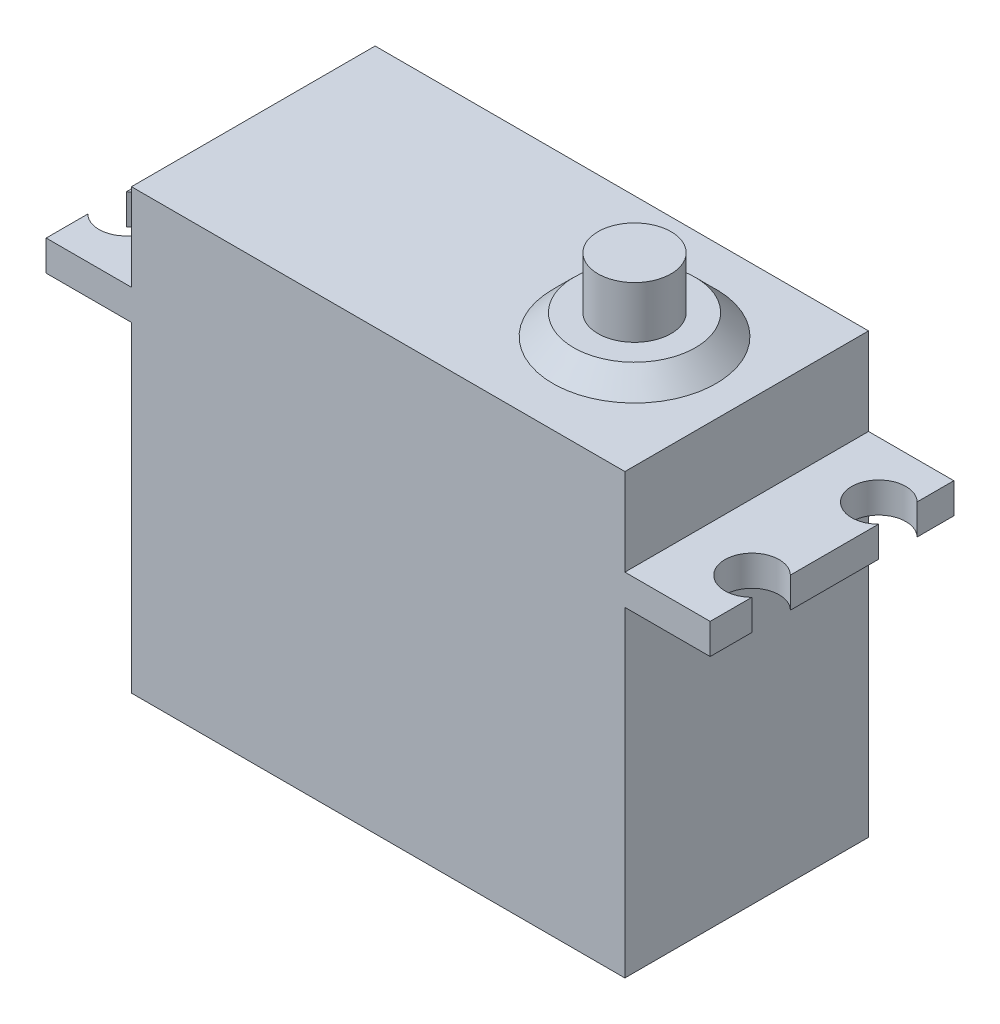
ISO-10303-21;
HEADER;
FILE_DESCRIPTION(('STEP AP214'),'2;1');
FILE_NAME('part.step','',(''),(''),'','','');
FILE_SCHEMA(('AUTOMOTIVE_DESIGN { 1 0 10303 214 1 1 1 1 }'));
ENDSEC;
DATA;
#1=APPLICATION_CONTEXT('core data for automotive mechanical design processes');
#2=APPLICATION_PROTOCOL_DEFINITION('international standard','automotive_design',2000,#1);
#3=PRODUCT_CONTEXT('',#1,'mechanical');
#4=PRODUCT('Part','Part','',(#3));
#5=PRODUCT_RELATED_PRODUCT_CATEGORY('part','',(#4));
#6=PRODUCT_DEFINITION_FORMATION('','',#4);
#7=PRODUCT_DEFINITION_CONTEXT('part definition',#1,'design');
#8=PRODUCT_DEFINITION('design','',#6,#7);
#9=PRODUCT_DEFINITION_SHAPE('','',#8);
#10=(LENGTH_UNIT() NAMED_UNIT(*) SI_UNIT(.MILLI.,.METRE.));
#11=(NAMED_UNIT(*) PLANE_ANGLE_UNIT() SI_UNIT($,.RADIAN.));
#12=(NAMED_UNIT(*) SI_UNIT($,.STERADIAN.) SOLID_ANGLE_UNIT());
#13=UNCERTAINTY_MEASURE_WITH_UNIT(LENGTH_MEASURE(1.E-05),#10,'distance_accuracy_value','');
#14=(GEOMETRIC_REPRESENTATION_CONTEXT(3) GLOBAL_UNCERTAINTY_ASSIGNED_CONTEXT((#13)) GLOBAL_UNIT_ASSIGNED_CONTEXT((#10,
#11,#12)) REPRESENTATION_CONTEXT('',''));
#15=CARTESIAN_POINT('',(0.,0.,0.));
#16=DIRECTION('',(0.,0.,1.));
#17=DIRECTION('',(1.,0.,0.));
#18=AXIS2_PLACEMENT_3D('',#15,#16,#17);
#19=CARTESIAN_POINT('',(-11.1528233528739,15.9018617021277,20.));
#20=DIRECTION('',(-1.,0.,0.));
#21=DIRECTION('',(0.,0.,1.));
#22=AXIS2_PLACEMENT_3D('',#19,#20,#21);
#23=PLANE('',#22);
#24=DIRECTION('',(0.,1.,0.));
#25=VECTOR('',#24,1.);
#26=CARTESIAN_POINT('',(-11.1528233528739,13.4018617021277,16.5865134729967));
#27=LINE('',#26,#25);
#28=CARTESIAN_POINT('',(-11.1528233528739,15.9018617021277,16.5865134729967));
#29=VERTEX_POINT('',#28);
#30=CARTESIAN_POINT('',(-11.1528233528739,18.4018617021277,16.5865134729967));
#31=VERTEX_POINT('',#30);
#32=EDGE_CURVE('E257',#29,#31,#27,.T.);
#33=ORIENTED_EDGE('',*,*,#32,.F.);
#34=DIRECTION('',(0.,0.,-1.));
#35=VECTOR('',#34,1.);
#36=CARTESIAN_POINT('',(-11.1528233528739,15.9018617021277,20.));
#37=LINE('',#36,#35);
#38=CARTESIAN_POINT('',(-11.1528233528739,15.9018617021277,20.));
#39=VERTEX_POINT('',#38);
#40=EDGE_CURVE('E212',#39,#29,#37,.T.);
#41=ORIENTED_EDGE('',*,*,#40,.F.);
#42=DIRECTION('',(0.,1.,0.));
#43=VECTOR('',#42,1.);
#44=CARTESIAN_POINT('',(-11.1528233528739,15.9018617021277,20.));
#45=LINE('',#44,#43);
#46=CARTESIAN_POINT('',(-11.1528233528739,18.4018617021277,20.));
#47=VERTEX_POINT('',#46);
#48=EDGE_CURVE('E302',#39,#47,#45,.T.);
#49=ORIENTED_EDGE('',*,*,#48,.T.);
#50=DIRECTION('',(0.,0.,-1.));
#51=VECTOR('',#50,1.);
#52=CARTESIAN_POINT('',(-11.1528233528739,18.4018617021277,20.));
#53=LINE('',#52,#51);
#54=EDGE_CURVE('E214',#47,#31,#53,.T.);
#55=ORIENTED_EDGE('',*,*,#54,.T.);
#56=EDGE_LOOP('',(#33,#41,#49,#55));
#57=FACE_BOUND('',#56,.T.);
#58=ADVANCED_FACE('F50',(#57),#23,.T.);
#59=DIRECTION('',(0.,1.,0.));
#60=VECTOR('',#59,1.);
#61=CARTESIAN_POINT('',(-11.1528233528739,13.4018617021277,13.4134865270033));
#62=LINE('',#61,#60);
#63=CARTESIAN_POINT('',(-11.1528233528739,18.4018617021277,13.4134865270033));
#64=VERTEX_POINT('',#63);
#65=CARTESIAN_POINT('',(-11.1528233528739,15.9018617021277,13.4134865270033));
#66=VERTEX_POINT('',#65);
#67=EDGE_CURVE('E75',#64,#66,#62,.F.);
#68=ORIENTED_EDGE('',*,*,#67,.F.);
#69=CARTESIAN_POINT('',(-11.1528233528739,18.4018617021277,6.18651347299668));
#70=VERTEX_POINT('',#69);
#71=EDGE_CURVE('E211',#64,#70,#53,.T.);
#72=ORIENTED_EDGE('',*,*,#71,.T.);
#73=DIRECTION('',(0.,1.,0.));
#74=VECTOR('',#73,1.);
#75=CARTESIAN_POINT('',(-11.1528233528739,13.4018617021277,6.18651347299668));
#76=LINE('',#75,#74);
#77=CARTESIAN_POINT('',(-11.1528233528739,15.9018617021277,6.18651347299668));
#78=VERTEX_POINT('',#77);
#79=EDGE_CURVE('E190',#78,#70,#76,.T.);
#80=ORIENTED_EDGE('',*,*,#79,.F.);
#81=EDGE_CURVE('E216',#66,#78,#37,.T.);
#82=ORIENTED_EDGE('',*,*,#81,.F.);
#83=EDGE_LOOP('',(#68,#72,#80,#82));
#84=FACE_BOUND('',#83,.T.);
#85=ADVANCED_FACE('F413',(#84),#23,.T.);
#86=CARTESIAN_POINT('',(43.3471766471261,18.4018617021277,20.));
#87=DIRECTION('',(1.,0.,0.));
#88=DIRECTION('',(0.,1.,0.));
#89=AXIS2_PLACEMENT_3D('',#86,#87,#88);
#90=PLANE('',#89);
#91=DIRECTION('',(0.,1.,0.));
#92=VECTOR('',#91,1.);
#93=CARTESIAN_POINT('',(43.3471766471261,13.4018617021277,13.4146673661342));
#94=LINE('',#93,#92);
#95=CARTESIAN_POINT('',(43.3471766471261,15.9018617021276,13.4146673661342));
#96=VERTEX_POINT('',#95);
#97=CARTESIAN_POINT('',(43.3471766471261,18.4018617021277,13.4146673661342));
#98=VERTEX_POINT('',#97);
#99=EDGE_CURVE('E269',#96,#98,#94,.T.);
#100=ORIENTED_EDGE('',*,*,#99,.F.);
#101=DIRECTION('',(0.,0.,-1.));
#102=VECTOR('',#101,1.);
#103=CARTESIAN_POINT('',(43.3471766471261,15.9018617021276,20.));
#104=LINE('',#103,#102);
#105=CARTESIAN_POINT('',(43.3471766471261,15.9018617021276,6.18533263386582));
#106=VERTEX_POINT('',#105);
#107=EDGE_CURVE('E355',#96,#106,#104,.T.);
#108=ORIENTED_EDGE('',*,*,#107,.T.);
#109=DIRECTION('',(0.,1.,0.));
#110=VECTOR('',#109,1.);
#111=CARTESIAN_POINT('',(43.3471766471261,13.4018617021277,6.18533263386582));
#112=LINE('',#111,#110);
#113=CARTESIAN_POINT('',(43.3471766471261,18.4018617021277,6.18533263386584));
#114=VERTEX_POINT('',#113);
#115=EDGE_CURVE('E259',#114,#106,#112,.F.);
#116=ORIENTED_EDGE('',*,*,#115,.F.);
#117=DIRECTION('',(0.,0.,-1.));
#118=VECTOR('',#117,1.);
#119=CARTESIAN_POINT('',(43.3471766471261,18.4018617021277,20.));
#120=LINE('',#119,#118);
#121=EDGE_CURVE('E360',#98,#114,#120,.T.);
#122=ORIENTED_EDGE('',*,*,#121,.F.);
#123=EDGE_LOOP('',(#100,#108,#116,#122));
#124=FACE_BOUND('',#123,.T.);
#125=ADVANCED_FACE('F415',(#124),#90,.T.);
#126=DIRECTION('',(0.,1.,0.));
#127=VECTOR('',#126,1.);
#128=CARTESIAN_POINT('',(43.3471766471261,13.4018617021277,3.01466736613418));
#129=LINE('',#128,#127);
#130=CARTESIAN_POINT('',(43.3471766471261,15.9018617021276,3.01466736613417));
#131=VERTEX_POINT('',#130);
#132=CARTESIAN_POINT('',(43.3471766471261,18.4018617021277,3.01466736613416));
#133=VERTEX_POINT('',#132);
#134=EDGE_CURVE('E263',#131,#133,#129,.T.);
#135=ORIENTED_EDGE('',*,*,#134,.F.);
#136=CARTESIAN_POINT('',(43.3471766471261,15.9018617021276,0.));
#137=VERTEX_POINT('',#136);
#138=EDGE_CURVE('E356',#131,#137,#104,.T.);
#139=ORIENTED_EDGE('',*,*,#138,.T.);
#140=DIRECTION('',(0.,-1.,0.));
#141=VECTOR('',#140,1.);
#142=CARTESIAN_POINT('',(43.3471766471261,18.4018617021277,0.));
#143=LINE('',#142,#141);
#144=CARTESIAN_POINT('',(43.3471766471261,18.4018617021277,0.));
#145=VERTEX_POINT('',#144);
#146=EDGE_CURVE('E317',#145,#137,#143,.T.);
#147=ORIENTED_EDGE('',*,*,#146,.F.);
#148=EDGE_CURVE('E361',#133,#145,#120,.T.);
#149=ORIENTED_EDGE('',*,*,#148,.F.);
#150=EDGE_LOOP('',(#135,#139,#147,#149));
#151=FACE_BOUND('',#150,.T.);
#152=ADVANCED_FACE('F388',(#151),#90,.T.);
#153=CARTESIAN_POINT('',(-11.1528233528739,18.4018617021277,20.));
#154=DIRECTION('',(0.,1.,0.));
#155=DIRECTION('',(0.,0.,1.));
#156=AXIS2_PLACEMENT_3D('',#153,#154,#155);
#157=PLANE('',#156);
#158=CARTESIAN_POINT('',(-9.59282335287387,18.4018617021277,15.));
#159=DIRECTION('',(0.,1.,0.));
#160=DIRECTION('',(0.,0.,1.));
#161=AXIS2_PLACEMENT_3D('',#158,#159,#160);
#162=CIRCLE('',#161,2.225);
#163=EDGE_CURVE('E195',#31,#64,#162,.T.);
#164=ORIENTED_EDGE('',*,*,#163,.F.);
#165=ORIENTED_EDGE('',*,*,#54,.F.);
#166=DIRECTION('',(1.,0.,0.));
#167=VECTOR('',#166,1.);
#168=CARTESIAN_POINT('',(-11.1528233528739,18.4018617021277,20.));
#169=LINE('',#168,#167);
#170=CARTESIAN_POINT('',(-4.15282335287388,18.4018617021277,20.));
#171=VERTEX_POINT('',#170);
#172=EDGE_CURVE('E271',#47,#171,#169,.T.);
#173=ORIENTED_EDGE('',*,*,#172,.T.);
#174=DIRECTION('',(0.,0.,-1.));
#175=VECTOR('',#174,1.);
#176=CARTESIAN_POINT('',(-4.15282335287388,18.4018617021277,20.));
#177=LINE('',#176,#175);
#178=CARTESIAN_POINT('',(-4.15282335287388,18.4018617021277,0.));
#179=VERTEX_POINT('',#178);
#180=EDGE_CURVE('E232',#171,#179,#177,.T.);
#181=ORIENTED_EDGE('',*,*,#180,.T.);
#182=DIRECTION('',(1.,0.,0.));
#183=VECTOR('',#182,1.);
#184=CARTESIAN_POINT('',(-11.1528233528739,18.4018617021277,0.));
#185=LINE('',#184,#183);
#186=CARTESIAN_POINT('',(-11.1528233528739,18.4018617021277,0.));
#187=VERTEX_POINT('',#186);
#188=EDGE_CURVE('E209',#187,#179,#185,.T.);
#189=ORIENTED_EDGE('',*,*,#188,.F.);
#190=CARTESIAN_POINT('',(-11.1528233528739,18.4018617021277,3.01348652700332));
#191=VERTEX_POINT('',#190);
#192=EDGE_CURVE('E202',#191,#187,#53,.T.);
#193=ORIENTED_EDGE('',*,*,#192,.F.);
#194=CARTESIAN_POINT('',(-9.59282335287387,18.4018617021277,4.6));
#195=DIRECTION('',(0.,1.,0.));
#196=DIRECTION('',(0.,0.,1.));
#197=AXIS2_PLACEMENT_3D('',#194,#195,#196);
#198=CIRCLE('',#197,2.225);
#199=EDGE_CURVE('E187',#70,#191,#198,.T.);
#200=ORIENTED_EDGE('',*,*,#199,.F.);
#201=ORIENTED_EDGE('',*,*,#71,.F.);
#202=EDGE_LOOP('',(#164,#165,#173,#181,#189,#193,#200,#201));
#203=FACE_BOUND('',#202,.T.);
#204=ADVANCED_FACE('F207',(#203),#157,.T.);
#205=DIRECTION('',(0.,1.,0.));
#206=VECTOR('',#205,1.);
#207=CARTESIAN_POINT('',(-11.1528233528739,13.4018617021277,3.01348652700332));
#208=LINE('',#207,#206);
#209=CARTESIAN_POINT('',(-11.1528233528739,15.9018617021277,3.01348652700332));
#210=VERTEX_POINT('',#209);
#211=EDGE_CURVE('E67',#191,#210,#208,.F.);
#212=ORIENTED_EDGE('',*,*,#211,.F.);
#213=ORIENTED_EDGE('',*,*,#192,.T.);
#214=DIRECTION('',(0.,1.,0.));
#215=VECTOR('',#214,1.);
#216=CARTESIAN_POINT('',(-11.1528233528739,15.9018617021277,0.));
#217=LINE('',#216,#215);
#218=CARTESIAN_POINT('',(-11.1528233528739,15.9018617021277,0.));
#219=VERTEX_POINT('',#218);
#220=EDGE_CURVE('E275',#219,#187,#217,.T.);
#221=ORIENTED_EDGE('',*,*,#220,.F.);
#222=EDGE_CURVE('E204',#210,#219,#37,.T.);
#223=ORIENTED_EDGE('',*,*,#222,.F.);
#224=EDGE_LOOP('',(#212,#213,#221,#223));
#225=FACE_BOUND('',#224,.T.);
#226=ADVANCED_FACE('F200',(#225),#23,.T.);
#227=CARTESIAN_POINT('',(-4.15282335287387,15.9018617021277,20.));
#228=DIRECTION('',(0.,-1.,0.));
#229=DIRECTION('',(0.,0.,-1.));
#230=AXIS2_PLACEMENT_3D('',#227,#228,#229);
#231=PLANE('',#230);
#232=CARTESIAN_POINT('',(-9.59282335287387,15.9018617021277,15.));
#233=DIRECTION('',(0.,-1.,0.));
#234=DIRECTION('',(0.,0.,-1.));
#235=AXIS2_PLACEMENT_3D('',#232,#233,#234);
#236=CIRCLE('',#235,2.225);
#237=EDGE_CURVE('E235',#66,#29,#236,.T.);
#238=ORIENTED_EDGE('',*,*,#237,.F.);
#239=ORIENTED_EDGE('',*,*,#81,.T.);
#240=CARTESIAN_POINT('',(-9.59282335287387,15.9018617021277,4.6));
#241=DIRECTION('',(0.,-1.,0.));
#242=DIRECTION('',(0.,0.,-1.));
#243=AXIS2_PLACEMENT_3D('',#240,#241,#242);
#244=CIRCLE('',#243,2.225);
#245=EDGE_CURVE('E229',#210,#78,#244,.T.);
#246=ORIENTED_EDGE('',*,*,#245,.F.);
#247=ORIENTED_EDGE('',*,*,#222,.T.);
#248=DIRECTION('',(-1.,0.,0.));
#249=VECTOR('',#248,1.);
#250=CARTESIAN_POINT('',(-4.15282335287387,15.9018617021277,0.));
#251=LINE('',#250,#249);
#252=CARTESIAN_POINT('',(-4.15282335287387,15.9018617021277,0.));
#253=VERTEX_POINT('',#252);
#254=EDGE_CURVE('E330',#253,#219,#251,.T.);
#255=ORIENTED_EDGE('',*,*,#254,.F.);
#256=DIRECTION('',(0.,0.,-1.));
#257=VECTOR('',#256,1.);
#258=CARTESIAN_POINT('',(-4.15282335287387,15.9018617021277,20.));
#259=LINE('',#258,#257);
#260=CARTESIAN_POINT('',(-4.15282335287387,15.9018617021277,20.));
#261=VERTEX_POINT('',#260);
#262=EDGE_CURVE('E339',#261,#253,#259,.T.);
#263=ORIENTED_EDGE('',*,*,#262,.F.);
#264=DIRECTION('',(-1.,0.,0.));
#265=VECTOR('',#264,1.);
#266=CARTESIAN_POINT('',(-4.15282335287387,15.9018617021277,20.));
#267=LINE('',#266,#265);
#268=EDGE_CURVE('E299',#261,#39,#267,.T.);
#269=ORIENTED_EDGE('',*,*,#268,.T.);
#270=ORIENTED_EDGE('',*,*,#40,.T.);
#271=EDGE_LOOP('',(#238,#239,#246,#247,#255,#263,#269,#270));
#272=FACE_BOUND('',#271,.T.);
#273=ADVANCED_FACE('F338',(#272),#231,.T.);
#274=CARTESIAN_POINT('',(-4.15282335287387,15.9018617021277,20.));
#275=DIRECTION('',(1.,0.,0.));
#276=DIRECTION('',(0.,1.,0.));
#277=AXIS2_PLACEMENT_3D('',#274,#275,#276);
#278=PLANE('',#277);
#279=DIRECTION('',(0.,-1.,0.));
#280=VECTOR('',#279,1.);
#281=CARTESIAN_POINT('',(-4.15282335287387,15.9018617021277,0.));
#282=LINE('',#281,#280);
#283=CARTESIAN_POINT('',(-4.15282335287386,-10.4481382978724,0.));
#284=VERTEX_POINT('',#283);
#285=EDGE_CURVE('E328',#253,#284,#282,.T.);
#286=ORIENTED_EDGE('',*,*,#285,.T.);
#287=DIRECTION('',(0.,0.,-1.));
#288=VECTOR('',#287,1.);
#289=CARTESIAN_POINT('',(-4.15282335287386,-10.4481382978724,20.));
#290=LINE('',#289,#288);
#291=CARTESIAN_POINT('',(-4.15282335287386,-10.4481382978724,20.));
#292=VERTEX_POINT('',#291);
#293=EDGE_CURVE('E342',#292,#284,#290,.T.);
#294=ORIENTED_EDGE('',*,*,#293,.F.);
#295=DIRECTION('',(0.,-1.,0.));
#296=VECTOR('',#295,1.);
#297=CARTESIAN_POINT('',(-4.15282335287387,15.9018617021277,20.));
#298=LINE('',#297,#296);
#299=EDGE_CURVE('E297',#261,#292,#298,.T.);
#300=ORIENTED_EDGE('',*,*,#299,.F.);
#301=ORIENTED_EDGE('',*,*,#262,.T.);
#302=EDGE_LOOP('',(#286,#294,#300,#301));
#303=FACE_BOUND('',#302,.T.);
#304=ADVANCED_FACE('F405',(#303),#278,.F.);
#305=CARTESIAN_POINT('',(-4.15282335287386,-10.4481382978724,20.));
#306=DIRECTION('',(0.,1.,0.));
#307=DIRECTION('',(0.,0.,1.));
#308=AXIS2_PLACEMENT_3D('',#305,#306,#307);
#309=PLANE('',#308);
#310=DIRECTION('',(1.,0.,0.));
#311=VECTOR('',#310,1.);
#312=CARTESIAN_POINT('',(-4.15282335287386,-10.4481382978724,0.));
#313=LINE('',#312,#311);
#314=CARTESIAN_POINT('',(36.3471766471261,-10.4481382978724,0.));
#315=VERTEX_POINT('',#314);
#316=EDGE_CURVE('E326',#284,#315,#313,.T.);
#317=ORIENTED_EDGE('',*,*,#316,.T.);
#318=DIRECTION('',(0.,0.,-1.));
#319=VECTOR('',#318,1.);
#320=CARTESIAN_POINT('',(36.3471766471261,-10.4481382978724,20.));
#321=LINE('',#320,#319);
#322=CARTESIAN_POINT('',(36.3471766471261,-10.4481382978724,20.));
#323=VERTEX_POINT('',#322);
#324=EDGE_CURVE('E347',#323,#315,#321,.T.);
#325=ORIENTED_EDGE('',*,*,#324,.F.);
#326=DIRECTION('',(1.,0.,0.));
#327=VECTOR('',#326,1.);
#328=CARTESIAN_POINT('',(-4.15282335287386,-10.4481382978724,20.));
#329=LINE('',#328,#327);
#330=EDGE_CURVE('E295',#292,#323,#329,.T.);
#331=ORIENTED_EDGE('',*,*,#330,.F.);
#332=ORIENTED_EDGE('',*,*,#293,.T.);
#333=EDGE_LOOP('',(#317,#325,#331,#332));
#334=FACE_BOUND('',#333,.T.);
#335=ADVANCED_FACE('F401',(#334),#309,.F.);
#336=CARTESIAN_POINT('',(36.3471766471261,-10.4481382978724,20.));
#337=DIRECTION('',(-1.,0.,0.));
#338=DIRECTION('',(0.,-1.,0.));
#339=AXIS2_PLACEMENT_3D('',#336,#337,#338);
#340=PLANE('',#339);
#341=DIRECTION('',(0.,1.,0.));
#342=VECTOR('',#341,1.);
#343=CARTESIAN_POINT('',(36.3471766471261,-10.4481382978724,0.));
#344=LINE('',#343,#342);
#345=CARTESIAN_POINT('',(36.3471766471261,15.9018617021277,0.));
#346=VERTEX_POINT('',#345);
#347=EDGE_CURVE('E323',#315,#346,#344,.T.);
#348=ORIENTED_EDGE('',*,*,#347,.T.);
#349=DIRECTION('',(0.,0.,-1.));
#350=VECTOR('',#349,1.);
#351=CARTESIAN_POINT('',(36.3471766471261,15.9018617021277,20.));
#352=LINE('',#351,#350);
#353=CARTESIAN_POINT('',(36.3471766471261,15.9018617021277,20.));
#354=VERTEX_POINT('',#353);
#355=EDGE_CURVE('E350',#354,#346,#352,.T.);
#356=ORIENTED_EDGE('',*,*,#355,.F.);
#357=DIRECTION('',(0.,1.,0.));
#358=VECTOR('',#357,1.);
#359=CARTESIAN_POINT('',(36.3471766471261,-10.4481382978724,20.));
#360=LINE('',#359,#358);
#361=EDGE_CURVE('E293',#323,#354,#360,.T.);
#362=ORIENTED_EDGE('',*,*,#361,.F.);
#363=ORIENTED_EDGE('',*,*,#324,.T.);
#364=EDGE_LOOP('',(#348,#356,#362,#363));
#365=FACE_BOUND('',#364,.T.);
#366=ADVANCED_FACE('F398',(#365),#340,.F.);
#367=CARTESIAN_POINT('',(43.3471766471261,15.9018617021276,20.));
#368=DIRECTION('',(0.,-1.,0.));
#369=DIRECTION('',(1.,0.,0.));
#370=AXIS2_PLACEMENT_3D('',#367,#368,#369);
#371=PLANE('',#370);
#372=CARTESIAN_POINT('',(41.7859766471261,15.9018617021276,15.));
#373=DIRECTION('',(0.,-1.,0.));
#374=DIRECTION('',(1.,0.,0.));
#375=AXIS2_PLACEMENT_3D('',#372,#373,#374);
#376=CIRCLE('',#375,2.225);
#377=CARTESIAN_POINT('',(43.3471766471261,15.9018617021276,16.5853326338658));
#378=VERTEX_POINT('',#377);
#379=EDGE_CURVE('E267',#378,#96,#376,.T.);
#380=ORIENTED_EDGE('',*,*,#379,.F.);
#381=CARTESIAN_POINT('',(43.3471766471261,15.9018617021276,20.));
#382=VERTEX_POINT('',#381);
#383=EDGE_CURVE('E352',#382,#378,#104,.T.);
#384=ORIENTED_EDGE('',*,*,#383,.F.);
#385=DIRECTION('',(-1.,0.,0.));
#386=VECTOR('',#385,1.);
#387=CARTESIAN_POINT('',(43.3471766471261,15.9018617021276,20.));
#388=LINE('',#387,#386);
#389=EDGE_CURVE('E290',#382,#354,#388,.T.);
#390=ORIENTED_EDGE('',*,*,#389,.T.);
#391=ORIENTED_EDGE('',*,*,#355,.T.);
#392=DIRECTION('',(-1.,0.,0.));
#393=VECTOR('',#392,1.);
#394=CARTESIAN_POINT('',(43.3471766471261,15.9018617021276,0.));
#395=LINE('',#394,#393);
#396=EDGE_CURVE('E320',#137,#346,#395,.T.);
#397=ORIENTED_EDGE('',*,*,#396,.F.);
#398=ORIENTED_EDGE('',*,*,#138,.F.);
#399=CARTESIAN_POINT('',(41.7859766471261,15.9018617021276,4.6));
#400=DIRECTION('',(0.,-1.,0.));
#401=DIRECTION('',(1.,0.,0.));
#402=AXIS2_PLACEMENT_3D('',#399,#400,#401);
#403=CIRCLE('',#402,2.225);
#404=EDGE_CURVE('E261',#106,#131,#403,.T.);
#405=ORIENTED_EDGE('',*,*,#404,.F.);
#406=ORIENTED_EDGE('',*,*,#107,.F.);
#407=EDGE_LOOP('',(#380,#384,#390,#391,#397,#398,#405,#406));
#408=FACE_BOUND('',#407,.T.);
#409=ADVANCED_FACE('F393',(#408),#371,.T.);
#410=DIRECTION('',(0.,1.,0.));
#411=VECTOR('',#410,1.);
#412=CARTESIAN_POINT('',(43.3471766471261,13.4018617021277,16.5853326338658));
#413=LINE('',#412,#411);
#414=CARTESIAN_POINT('',(43.3471766471261,18.4018617021277,16.5853326338658));
#415=VERTEX_POINT('',#414);
#416=EDGE_CURVE('E265',#415,#378,#413,.F.);
#417=ORIENTED_EDGE('',*,*,#416,.F.);
#418=CARTESIAN_POINT('',(43.3471766471261,18.4018617021277,20.));
#419=VERTEX_POINT('',#418);
#420=EDGE_CURVE('E357',#419,#415,#120,.T.);
#421=ORIENTED_EDGE('',*,*,#420,.F.);
#422=DIRECTION('',(0.,-1.,0.));
#423=VECTOR('',#422,1.);
#424=CARTESIAN_POINT('',(43.3471766471261,18.4018617021277,20.));
#425=LINE('',#424,#423);
#426=EDGE_CURVE('E287',#419,#382,#425,.T.);
#427=ORIENTED_EDGE('',*,*,#426,.T.);
#428=ORIENTED_EDGE('',*,*,#383,.T.);
#429=EDGE_LOOP('',(#417,#421,#427,#428));
#430=FACE_BOUND('',#429,.T.);
#431=ADVANCED_FACE('F423',(#430),#90,.T.);
#432=CARTESIAN_POINT('',(36.3471766471261,18.4018617021277,20.));
#433=DIRECTION('',(0.,1.,0.));
#434=DIRECTION('',(0.,0.,1.));
#435=AXIS2_PLACEMENT_3D('',#432,#433,#434);
#436=PLANE('',#435);
#437=CARTESIAN_POINT('',(41.7859766471261,18.4018617021277,15.));
#438=DIRECTION('',(0.,1.,0.));
#439=DIRECTION('',(0.,0.,1.));
#440=AXIS2_PLACEMENT_3D('',#437,#438,#439);
#441=CIRCLE('',#440,2.225);
#442=EDGE_CURVE('E224',#98,#415,#441,.T.);
#443=ORIENTED_EDGE('',*,*,#442,.F.);
#444=ORIENTED_EDGE('',*,*,#121,.T.);
#445=CARTESIAN_POINT('',(41.7859766471261,18.4018617021277,4.6));
#446=DIRECTION('',(0.,1.,0.));
#447=DIRECTION('',(0.,0.,1.));
#448=AXIS2_PLACEMENT_3D('',#445,#446,#447);
#449=CIRCLE('',#448,2.225);
#450=EDGE_CURVE('E220',#133,#114,#449,.T.);
#451=ORIENTED_EDGE('',*,*,#450,.F.);
#452=ORIENTED_EDGE('',*,*,#148,.T.);
#453=DIRECTION('',(1.,0.,0.));
#454=VECTOR('',#453,1.);
#455=CARTESIAN_POINT('',(36.3471766471261,18.4018617021277,0.));
#456=LINE('',#455,#454);
#457=CARTESIAN_POINT('',(36.3471766471261,18.4018617021277,0.));
#458=VERTEX_POINT('',#457);
#459=EDGE_CURVE('E314',#458,#145,#456,.T.);
#460=ORIENTED_EDGE('',*,*,#459,.F.);
#461=DIRECTION('',(0.,0.,-1.));
#462=VECTOR('',#461,1.);
#463=CARTESIAN_POINT('',(36.3471766471261,18.4018617021277,20.));
#464=LINE('',#463,#462);
#465=CARTESIAN_POINT('',(36.3471766471261,18.4018617021277,20.));
#466=VERTEX_POINT('',#465);
#467=EDGE_CURVE('E362',#466,#458,#464,.T.);
#468=ORIENTED_EDGE('',*,*,#467,.F.);
#469=DIRECTION('',(1.,0.,0.));
#470=VECTOR('',#469,1.);
#471=CARTESIAN_POINT('',(36.3471766471261,18.4018617021277,20.));
#472=LINE('',#471,#470);
#473=EDGE_CURVE('E284',#466,#419,#472,.T.);
#474=ORIENTED_EDGE('',*,*,#473,.T.);
#475=ORIENTED_EDGE('',*,*,#420,.T.);
#476=EDGE_LOOP('',(#443,#444,#451,#452,#460,#468,#474,#475));
#477=FACE_BOUND('',#476,.T.);
#478=ADVANCED_FACE('F381',(#477),#436,.T.);
#479=CARTESIAN_POINT('',(36.3471766471261,25.5518617021276,20.));
#480=DIRECTION('',(1.,0.,0.));
#481=DIRECTION('',(0.,1.,0.));
#482=AXIS2_PLACEMENT_3D('',#479,#480,#481);
#483=PLANE('',#482);
#484=DIRECTION('',(0.,-1.,0.));
#485=VECTOR('',#484,1.);
#486=CARTESIAN_POINT('',(36.3471766471261,25.5518617021276,0.));
#487=LINE('',#486,#485);
#488=CARTESIAN_POINT('',(36.3471766471261,25.5518617021276,0.));
#489=VERTEX_POINT('',#488);
#490=EDGE_CURVE('E311',#489,#458,#487,.T.);
#491=ORIENTED_EDGE('',*,*,#490,.F.);
#492=DIRECTION('',(0.,0.,-1.));
#493=VECTOR('',#492,1.);
#494=CARTESIAN_POINT('',(36.3471766471261,25.5518617021276,20.));
#495=LINE('',#494,#493);
#496=CARTESIAN_POINT('',(36.3471766471261,25.5518617021276,20.));
#497=VERTEX_POINT('',#496);
#498=EDGE_CURVE('E364',#497,#489,#495,.T.);
#499=ORIENTED_EDGE('',*,*,#498,.F.);
#500=DIRECTION('',(0.,-1.,0.));
#501=VECTOR('',#500,1.);
#502=CARTESIAN_POINT('',(36.3471766471261,25.5518617021276,20.));
#503=LINE('',#502,#501);
#504=EDGE_CURVE('E281',#497,#466,#503,.T.);
#505=ORIENTED_EDGE('',*,*,#504,.T.);
#506=ORIENTED_EDGE('',*,*,#467,.T.);
#507=EDGE_LOOP('',(#491,#499,#505,#506));
#508=FACE_BOUND('',#507,.T.);
#509=ADVANCED_FACE('F376',(#508),#483,.T.);
#510=CARTESIAN_POINT('',(-4.15282335287388,25.5518617021276,20.));
#511=DIRECTION('',(0.,1.,0.));
#512=DIRECTION('',(-1.,0.,0.));
#513=AXIS2_PLACEMENT_3D('',#510,#511,#512);
#514=PLANE('',#513);
#515=CARTESIAN_POINT('',(27.139664617592,25.5518617021276,10.));
#516=DIRECTION('',(0.,1.,0.));
#517=DIRECTION('',(-1.,0.,0.));
#518=AXIS2_PLACEMENT_3D('',#515,#516,#517);
#519=CIRCLE('',#518,6.69999999999998);
#520=CARTESIAN_POINT('',(20.439664617592,25.5518617021276,10.));
#521=VERTEX_POINT('',#520);
#522=EDGE_CURVE('E55',#521,#521,#519,.F.);
#523=ORIENTED_EDGE('',*,*,#522,.T.);
#524=EDGE_LOOP('',(#523));
#525=FACE_BOUND('',#524,.T.);
#526=DIRECTION('',(1.,0.,0.));
#527=VECTOR('',#526,1.);
#528=CARTESIAN_POINT('',(-4.15282335287388,25.5518617021276,0.));
#529=LINE('',#528,#527);
#530=CARTESIAN_POINT('',(-4.15282335287388,25.5518617021276,0.));
#531=VERTEX_POINT('',#530);
#532=EDGE_CURVE('E308',#531,#489,#529,.T.);
#533=ORIENTED_EDGE('',*,*,#532,.F.);
#534=DIRECTION('',(0.,0.,-1.));
#535=VECTOR('',#534,1.);
#536=CARTESIAN_POINT('',(-4.15282335287388,25.5518617021276,20.));
#537=LINE('',#536,#535);
#538=CARTESIAN_POINT('',(-4.15282335287388,25.5518617021276,20.));
#539=VERTEX_POINT('',#538);
#540=EDGE_CURVE('E365',#539,#531,#537,.T.);
#541=ORIENTED_EDGE('',*,*,#540,.F.);
#542=DIRECTION('',(1.,0.,0.));
#543=VECTOR('',#542,1.);
#544=CARTESIAN_POINT('',(-4.15282335287388,25.5518617021276,20.));
#545=LINE('',#544,#543);
#546=EDGE_CURVE('E278',#539,#497,#545,.T.);
#547=ORIENTED_EDGE('',*,*,#546,.T.);
#548=ORIENTED_EDGE('',*,*,#498,.T.);
#549=EDGE_LOOP('',(#533,#541,#547,#548));
#550=FACE_BOUND('',#549,.T.);
#551=ADVANCED_FACE('F239',(#525,#550),#514,.T.);
#552=CARTESIAN_POINT('',(-4.15282335287388,18.4018617021277,20.));
#553=DIRECTION('',(-1.,0.,0.));
#554=DIRECTION('',(0.,0.,1.));
#555=AXIS2_PLACEMENT_3D('',#552,#553,#554);
#556=PLANE('',#555);
#557=DIRECTION('',(0.,1.,0.));
#558=VECTOR('',#557,1.);
#559=CARTESIAN_POINT('',(-4.15282335287388,18.4018617021277,0.));
#560=LINE('',#559,#558);
#561=EDGE_CURVE('E305',#179,#531,#560,.T.);
#562=ORIENTED_EDGE('',*,*,#561,.F.);
#563=ORIENTED_EDGE('',*,*,#180,.F.);
#564=DIRECTION('',(0.,1.,0.));
#565=VECTOR('',#564,1.);
#566=CARTESIAN_POINT('',(-4.15282335287388,18.4018617021277,20.));
#567=LINE('',#566,#565);
#568=EDGE_CURVE('E274',#171,#539,#567,.T.);
#569=ORIENTED_EDGE('',*,*,#568,.T.);
#570=ORIENTED_EDGE('',*,*,#540,.T.);
#571=EDGE_LOOP('',(#562,#563,#569,#570));
#572=FACE_BOUND('',#571,.T.);
#573=ADVANCED_FACE('F371',(#572),#556,.T.);
#574=CARTESIAN_POINT('',(0.,0.,20.));
#575=DIRECTION('',(0.,0.,1.));
#576=DIRECTION('',(1.,0.,0.));
#577=AXIS2_PLACEMENT_3D('',#574,#575,#576);
#578=PLANE('',#577);
#579=ORIENTED_EDGE('',*,*,#172,.F.);
#580=ORIENTED_EDGE('',*,*,#48,.F.);
#581=ORIENTED_EDGE('',*,*,#268,.F.);
#582=ORIENTED_EDGE('',*,*,#299,.T.);
#583=ORIENTED_EDGE('',*,*,#330,.T.);
#584=ORIENTED_EDGE('',*,*,#361,.T.);
#585=ORIENTED_EDGE('',*,*,#389,.F.);
#586=ORIENTED_EDGE('',*,*,#426,.F.);
#587=ORIENTED_EDGE('',*,*,#473,.F.);
#588=ORIENTED_EDGE('',*,*,#504,.F.);
#589=ORIENTED_EDGE('',*,*,#546,.F.);
#590=ORIENTED_EDGE('',*,*,#568,.F.);
#591=EDGE_LOOP('',(#579,#580,#581,#582,#583,#584,#585,#586,#587,#588,#589,#590));
#592=FACE_BOUND('',#591,.T.);
#593=ADVANCED_FACE('F409',(#592),#578,.T.);
#594=CARTESIAN_POINT('',(0.,0.,0.));
#595=DIRECTION('',(0.,0.,1.));
#596=DIRECTION('',(1.,0.,0.));
#597=AXIS2_PLACEMENT_3D('',#594,#595,#596);
#598=PLANE('',#597);
#599=ORIENTED_EDGE('',*,*,#188,.T.);
#600=ORIENTED_EDGE('',*,*,#561,.T.);
#601=ORIENTED_EDGE('',*,*,#532,.T.);
#602=ORIENTED_EDGE('',*,*,#490,.T.);
#603=ORIENTED_EDGE('',*,*,#459,.T.);
#604=ORIENTED_EDGE('',*,*,#146,.T.);
#605=ORIENTED_EDGE('',*,*,#396,.T.);
#606=ORIENTED_EDGE('',*,*,#347,.F.);
#607=ORIENTED_EDGE('',*,*,#316,.F.);
#608=ORIENTED_EDGE('',*,*,#285,.F.);
#609=ORIENTED_EDGE('',*,*,#254,.T.);
#610=ORIENTED_EDGE('',*,*,#220,.T.);
#611=EDGE_LOOP('',(#599,#600,#601,#602,#603,#604,#605,#606,#607,#608,#609,#610));
#612=FACE_BOUND('',#611,.T.);
#613=ADVANCED_FACE('F333',(#612),#598,.F.);
#614=CARTESIAN_POINT('',(41.7859766471261,13.4018617021277,4.6));
#615=DIRECTION('',(0.,1.,0.));
#616=DIRECTION('',(0.,0.,1.));
#617=AXIS2_PLACEMENT_3D('',#614,#615,#616);
#618=CYLINDRICAL_SURFACE('',#617,2.225);
#619=ORIENTED_EDGE('',*,*,#134,.T.);
#620=ORIENTED_EDGE('',*,*,#450,.T.);
#621=ORIENTED_EDGE('',*,*,#115,.T.);
#622=ORIENTED_EDGE('',*,*,#404,.T.);
#623=EDGE_LOOP('',(#619,#620,#621,#622));
#624=FACE_BOUND('',#623,.T.);
#625=ADVANCED_FACE('F504',(#624),#618,.F.);
#626=CARTESIAN_POINT('',(41.7859766471261,13.4018617021277,15.));
#627=DIRECTION('',(0.,1.,0.));
#628=DIRECTION('',(0.,0.,1.));
#629=AXIS2_PLACEMENT_3D('',#626,#627,#628);
#630=CYLINDRICAL_SURFACE('',#629,2.225);
#631=ORIENTED_EDGE('',*,*,#99,.T.);
#632=ORIENTED_EDGE('',*,*,#442,.T.);
#633=ORIENTED_EDGE('',*,*,#416,.T.);
#634=ORIENTED_EDGE('',*,*,#379,.T.);
#635=EDGE_LOOP('',(#631,#632,#633,#634));
#636=FACE_BOUND('',#635,.T.);
#637=ADVANCED_FACE('F510',(#636),#630,.F.);
#638=CARTESIAN_POINT('',(-9.59282335287387,13.4018617021277,4.6));
#639=DIRECTION('',(0.,1.,0.));
#640=DIRECTION('',(0.,0.,1.));
#641=AXIS2_PLACEMENT_3D('',#638,#639,#640);
#642=CYLINDRICAL_SURFACE('',#641,2.225);
#643=ORIENTED_EDGE('',*,*,#79,.T.);
#644=ORIENTED_EDGE('',*,*,#199,.T.);
#645=ORIENTED_EDGE('',*,*,#211,.T.);
#646=ORIENTED_EDGE('',*,*,#245,.T.);
#647=EDGE_LOOP('',(#643,#644,#645,#646));
#648=FACE_BOUND('',#647,.T.);
#649=ADVANCED_FACE('F188',(#648),#642,.F.);
#650=CARTESIAN_POINT('',(-9.59282335287387,13.4018617021277,15.));
#651=DIRECTION('',(0.,1.,0.));
#652=DIRECTION('',(0.,0.,1.));
#653=AXIS2_PLACEMENT_3D('',#650,#651,#652);
#654=CYLINDRICAL_SURFACE('',#653,2.225);
#655=ORIENTED_EDGE('',*,*,#32,.T.);
#656=ORIENTED_EDGE('',*,*,#163,.T.);
#657=ORIENTED_EDGE('',*,*,#67,.T.);
#658=ORIENTED_EDGE('',*,*,#237,.T.);
#659=EDGE_LOOP('',(#655,#656,#657,#658));
#660=FACE_BOUND('',#659,.T.);
#661=ADVANCED_FACE('F411',(#660),#654,.F.);
#662=CARTESIAN_POINT('',(27.139664617592,27.2518617021276,10.));
#663=DIRECTION('',(0.,1.,0.));
#664=DIRECTION('',(-1.,0.,0.));
#665=AXIS2_PLACEMENT_3D('',#662,#663,#664);
#666=PLANE('',#665);
#667=CARTESIAN_POINT('',(27.139664617592,27.2518617021276,10.));
#668=DIRECTION('',(0.,1.,0.));
#669=DIRECTION('',(-1.,0.,0.));
#670=AXIS2_PLACEMENT_3D('',#667,#668,#669);
#671=CIRCLE('',#670,3.);
#672=CARTESIAN_POINT('',(24.139664617592,27.2518617021276,10.));
#673=VERTEX_POINT('',#672);
#674=EDGE_CURVE('E13',#673,#673,#671,.T.);
#675=ORIENTED_EDGE('',*,*,#674,.F.);
#676=EDGE_LOOP('',(#675));
#677=FACE_BOUND('',#676,.T.);
#678=CARTESIAN_POINT('',(27.139664617592,27.2518617021276,10.));
#679=DIRECTION('',(0.,1.,0.));
#680=DIRECTION('',(-1.,0.,0.));
#681=AXIS2_PLACEMENT_3D('',#678,#679,#680);
#682=CIRCLE('',#681,5.);
#683=CARTESIAN_POINT('',(22.139664617592,27.2518617021276,10.));
#684=VERTEX_POINT('',#683);
#685=EDGE_CURVE('E196',#684,#684,#682,.T.);
#686=ORIENTED_EDGE('',*,*,#685,.T.);
#687=EDGE_LOOP('',(#686));
#688=FACE_BOUND('',#687,.T.);
#689=ADVANCED_FACE('F245',(#677,#688),#666,.T.);
#690=CARTESIAN_POINT('',(27.139664617592,27.2518617021276,10.));
#691=DIRECTION('',(0.,-1.,0.));
#692=DIRECTION('',(0.,0.,-1.));
#693=AXIS2_PLACEMENT_3D('',#690,#691,#692);
#694=CONICAL_SURFACE('',#693,5.,0.785398163397442);
#695=ORIENTED_EDGE('',*,*,#522,.F.);
#696=EDGE_LOOP('',(#695));
#697=FACE_BOUND('',#696,.T.);
#698=ORIENTED_EDGE('',*,*,#685,.F.);
#699=EDGE_LOOP('',(#698));
#700=FACE_BOUND('',#699,.T.);
#701=ADVANCED_FACE('F53',(#697,#700),#694,.T.);
#702=CARTESIAN_POINT('',(27.139664617592,31.5018617021276,10.));
#703=DIRECTION('',(0.,-1.,0.));
#704=DIRECTION('',(1.,0.,0.));
#705=AXIS2_PLACEMENT_3D('',#702,#703,#704);
#706=CYLINDRICAL_SURFACE('',#705,3.);
#707=CARTESIAN_POINT('',(27.139664617592,31.5018617021276,10.));
#708=DIRECTION('',(0.,1.,0.));
#709=DIRECTION('',(-1.,0.,0.));
#710=AXIS2_PLACEMENT_3D('',#707,#708,#709);
#711=CIRCLE('',#710,3.);
#712=CARTESIAN_POINT('',(24.139664617592,31.5018617021276,10.));
#713=VERTEX_POINT('',#712);
#714=EDGE_CURVE('E249',#713,#713,#711,.T.);
#715=ORIENTED_EDGE('',*,*,#714,.F.);
#716=EDGE_LOOP('',(#715));
#717=FACE_BOUND('',#716,.T.);
#718=ORIENTED_EDGE('',*,*,#674,.T.);
#719=EDGE_LOOP('',(#718));
#720=FACE_BOUND('',#719,.T.);
#721=ADVANCED_FACE('F244',(#717,#720),#706,.T.);
#722=CARTESIAN_POINT('',(27.139664617592,31.5018617021276,10.));
#723=DIRECTION('',(0.,1.,0.));
#724=DIRECTION('',(-1.,0.,0.));
#725=AXIS2_PLACEMENT_3D('',#722,#723,#724);
#726=PLANE('',#725);
#727=ORIENTED_EDGE('',*,*,#714,.T.);
#728=EDGE_LOOP('',(#727));
#729=FACE_BOUND('',#728,.T.);
#730=ADVANCED_FACE('F546',(#729),#726,.T.);
#731=CLOSED_SHELL('',(#58,#85,#125,#152,#204,#226,#273,#304,#335,#366,#409,#431,#478,#509,#551,
#573,#593,#613,#625,#637,#649,#661,#689,#701,#721,#730));
#732=MANIFOLD_SOLID_BREP('B2',#731);
#733=ADVANCED_BREP_SHAPE_REPRESENTATION('',(#18,#732),#14);
#734=SHAPE_DEFINITION_REPRESENTATION(#9,#733);
ENDSEC;
END-ISO-10303-21;
